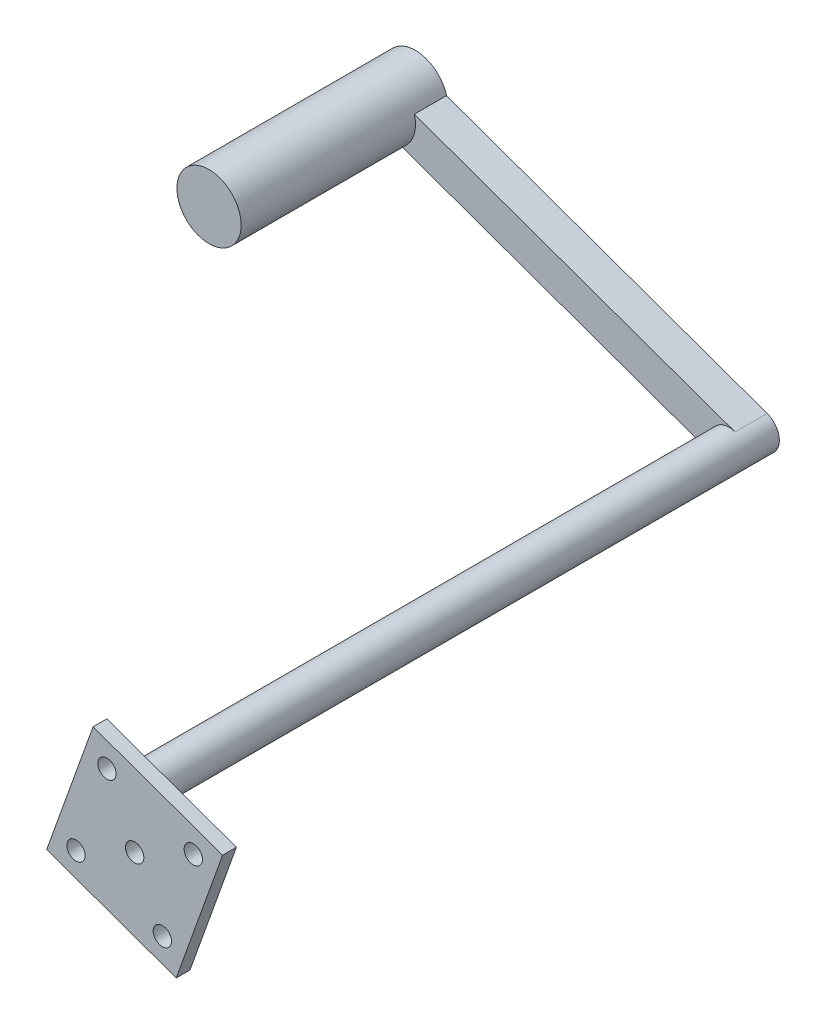
ISO-10303-21;
HEADER;
FILE_DESCRIPTION(('STEP AP214'),'2;1');
FILE_NAME('part.step','',(''),(''),'','','');
FILE_SCHEMA(('AUTOMOTIVE_DESIGN { 1 0 10303 214 1 1 1 1 }'));
ENDSEC;
DATA;
#1=APPLICATION_CONTEXT('core data for automotive mechanical design processes');
#2=APPLICATION_PROTOCOL_DEFINITION('international standard','automotive_design',2000,#1);
#3=PRODUCT_CONTEXT('',#1,'mechanical');
#4=PRODUCT('Part','Part','',(#3));
#5=PRODUCT_RELATED_PRODUCT_CATEGORY('part','',(#4));
#6=PRODUCT_DEFINITION_FORMATION('','',#4);
#7=PRODUCT_DEFINITION_CONTEXT('part definition',#1,'design');
#8=PRODUCT_DEFINITION('design','',#6,#7);
#9=PRODUCT_DEFINITION_SHAPE('','',#8);
#10=(LENGTH_UNIT() NAMED_UNIT(*) SI_UNIT(.MILLI.,.METRE.));
#11=(NAMED_UNIT(*) PLANE_ANGLE_UNIT() SI_UNIT($,.RADIAN.));
#12=(NAMED_UNIT(*) SI_UNIT($,.STERADIAN.) SOLID_ANGLE_UNIT());
#13=UNCERTAINTY_MEASURE_WITH_UNIT(LENGTH_MEASURE(1.E-05),#10,'distance_accuracy_value','');
#14=(GEOMETRIC_REPRESENTATION_CONTEXT(3) GLOBAL_UNCERTAINTY_ASSIGNED_CONTEXT((#13)) GLOBAL_UNIT_ASSIGNED_CONTEXT((#10,
#11,#12)) REPRESENTATION_CONTEXT('',''));
#15=CARTESIAN_POINT('',(0.,0.,0.));
#16=DIRECTION('',(0.,0.,1.));
#17=DIRECTION('',(1.,0.,0.));
#18=AXIS2_PLACEMENT_3D('',#15,#16,#17);
#19=CARTESIAN_POINT('',(-86.6066497970745,-63.7835303855215,45.));
#20=DIRECTION('',(0.,0.,-1.));
#21=DIRECTION('',(-1.,0.,0.));
#22=AXIS2_PLACEMENT_3D('',#19,#20,#21);
#23=CYLINDRICAL_SURFACE('',#22,7.);
#24=CARTESIAN_POINT('',(-86.6066497970745,-63.7835303855215,0.));
#25=DIRECTION('',(0.,0.,1.));
#26=DIRECTION('',(1.,0.,0.));
#27=AXIS2_PLACEMENT_3D('',#24,#25,#26);
#28=CIRCLE('',#27,7.);
#29=CARTESIAN_POINT('',(-79.8496648741146,-61.9551007995401,0.));
#30=VERTEX_POINT('',#29);
#31=CARTESIAN_POINT('',(-82.5475279582593,-69.4864708461657,0.));
#32=VERTEX_POINT('',#31);
#33=EDGE_CURVE('E161',#30,#32,#28,.T.);
#34=ORIENTED_EDGE('',*,*,#33,.T.);
#35=DIRECTION('',(0.,0.,-1.));
#36=VECTOR('',#35,1.);
#37=CARTESIAN_POINT('',(-82.5475279582593,-69.4864708461657,45.));
#38=LINE('',#37,#36);
#39=CARTESIAN_POINT('',(-82.5475279582593,-69.4864708461657,7.));
#40=VERTEX_POINT('',#39);
#41=EDGE_CURVE('E55',#32,#40,#38,.F.);
#42=ORIENTED_EDGE('',*,*,#41,.T.);
#43=CARTESIAN_POINT('',(-86.6066497970745,-63.7835303855215,7.));
#44=DIRECTION('',(0.,0.,-1.));
#45=DIRECTION('',(-1.,0.,0.));
#46=AXIS2_PLACEMENT_3D('',#43,#44,#45);
#47=CIRCLE('',#46,7.);
#48=CARTESIAN_POINT('',(-79.8496648741146,-61.9551007995401,7.));
#49=VERTEX_POINT('',#48);
#50=EDGE_CURVE('E11',#49,#40,#47,.T.);
#51=ORIENTED_EDGE('',*,*,#50,.F.);
#52=DIRECTION('',(0.,0.,-1.));
#53=VECTOR('',#52,1.);
#54=CARTESIAN_POINT('',(-79.8496648741146,-61.9551007995401,45.));
#55=LINE('',#54,#53);
#56=EDGE_CURVE('E156',#49,#30,#55,.T.);
#57=ORIENTED_EDGE('',*,*,#56,.T.);
#58=EDGE_LOOP('',(#34,#42,#51,#57));
#59=FACE_BOUND('',#58,.T.);
#60=CARTESIAN_POINT('',(-86.6066497970745,-63.7835303855215,45.));
#61=DIRECTION('',(0.,0.,1.));
#62=DIRECTION('',(1.,0.,0.));
#63=AXIS2_PLACEMENT_3D('',#60,#61,#62);
#64=CIRCLE('',#63,7.);
#65=CARTESIAN_POINT('',(-79.6066497970745,-63.7835303855215,45.));
#66=VERTEX_POINT('',#65);
#67=EDGE_CURVE('E48',#66,#66,#64,.T.);
#68=ORIENTED_EDGE('',*,*,#67,.F.);
#69=EDGE_LOOP('',(#68));
#70=FACE_BOUND('',#69,.T.);
#71=ADVANCED_FACE('F41',(#59,#70),#23,.T.);
#72=CARTESIAN_POINT('',(-86.6066497970745,-63.7835303855215,45.));
#73=DIRECTION('',(0.,0.,1.));
#74=DIRECTION('',(1.,0.,0.));
#75=AXIS2_PLACEMENT_3D('',#72,#73,#74);
#76=PLANE('',#75);
#77=ORIENTED_EDGE('',*,*,#67,.T.);
#78=EDGE_LOOP('',(#77));
#79=FACE_BOUND('',#78,.T.);
#80=ADVANCED_FACE('F191',(#79),#76,.T.);
#81=CARTESIAN_POINT('',(-86.6066497970745,-63.7835303855215,0.));
#82=DIRECTION('',(0.,0.,1.));
#83=DIRECTION('',(1.,0.,0.));
#84=AXIS2_PLACEMENT_3D('',#81,#82,#83);
#85=PLANE('',#84);
#86=ORIENTED_EDGE('',*,*,#33,.F.);
#87=DIRECTION('',(0.941421255828203,-0.337232885518078,0.));
#88=VECTOR('',#87,1.);
#89=CARTESIAN_POINT('',(-85.2577182550022,-60.0178453622087,0.));
#90=LINE('',#89,#88);
#91=CARTESIAN_POINT('',(-9.94401778874597,-86.9964762036549,0.));
#92=VERTEX_POINT('',#91);
#93=EDGE_CURVE('E138',#30,#92,#90,.T.);
#94=ORIENTED_EDGE('',*,*,#93,.T.);
#95=CARTESIAN_POINT('',(-11.2929493308183,-90.7621612269677,0.));
#96=DIRECTION('',(0.,0.,-1.));
#97=DIRECTION('',(-1.,0.,0.));
#98=AXIS2_PLACEMENT_3D('',#95,#96,#97);
#99=CIRCLE('',#98,4.00000000000002);
#100=CARTESIAN_POINT('',(-12.6418808728906,-94.5278462502806,0.));
#101=VERTEX_POINT('',#100);
#102=EDGE_CURVE('E149',#92,#101,#99,.T.);
#103=ORIENTED_EDGE('',*,*,#102,.T.);
#104=DIRECTION('',(-0.941421255828203,0.337232885518078,0.));
#105=VECTOR('',#104,1.);
#106=CARTESIAN_POINT('',(-87.9555813391469,-67.5492154088343,0.));
#107=LINE('',#106,#105);
#108=EDGE_CURVE('E144',#101,#32,#107,.T.);
#109=ORIENTED_EDGE('',*,*,#108,.T.);
#110=EDGE_LOOP('',(#86,#94,#103,#109));
#111=FACE_BOUND('',#110,.T.);
#112=ADVANCED_FACE('F170',(#111),#85,.F.);
#113=CARTESIAN_POINT('',(-87.9555813391469,-67.5492154088343,7.));
#114=DIRECTION('',(-0.337232885518078,-0.941421255828203,0.));
#115=DIRECTION('',(0.941421255828203,-0.337232885518078,0.));
#116=AXIS2_PLACEMENT_3D('',#113,#114,#115);
#117=PLANE('',#116);
#118=ORIENTED_EDGE('',*,*,#41,.F.);
#119=ORIENTED_EDGE('',*,*,#108,.F.);
#120=DIRECTION('',(0.,0.,-1.));
#121=VECTOR('',#120,1.);
#122=CARTESIAN_POINT('',(-12.6418808728906,-94.5278462502806,7.));
#123=LINE('',#122,#121);
#124=CARTESIAN_POINT('',(-12.6418808728906,-94.5278462502806,7.));
#125=VERTEX_POINT('',#124);
#126=EDGE_CURVE('E154',#125,#101,#123,.T.);
#127=ORIENTED_EDGE('',*,*,#126,.F.);
#128=DIRECTION('',(-0.941421255828203,0.337232885518078,0.));
#129=VECTOR('',#128,1.);
#130=CARTESIAN_POINT('',(-87.9555813391469,-67.5492154088343,7.));
#131=LINE('',#130,#129);
#132=EDGE_CURVE('E143',#125,#40,#131,.T.);
#133=ORIENTED_EDGE('',*,*,#132,.T.);
#134=EDGE_LOOP('',(#118,#119,#127,#133));
#135=FACE_BOUND('',#134,.T.);
#136=ADVANCED_FACE('F168',(#135),#117,.T.);
#137=CARTESIAN_POINT('',(-85.2577182550022,-60.0178453622087,7.));
#138=DIRECTION('',(0.337232885518078,0.941421255828203,0.));
#139=DIRECTION('',(-0.941421255828203,0.337232885518078,0.));
#140=AXIS2_PLACEMENT_3D('',#137,#138,#139);
#141=PLANE('',#140);
#142=ORIENTED_EDGE('',*,*,#56,.F.);
#143=DIRECTION('',(0.941421255828203,-0.337232885518078,0.));
#144=VECTOR('',#143,1.);
#145=CARTESIAN_POINT('',(-85.2577182550022,-60.0178453622087,7.));
#146=LINE('',#145,#144);
#147=CARTESIAN_POINT('',(-9.94401778874597,-86.9964762036549,7.));
#148=VERTEX_POINT('',#147);
#149=EDGE_CURVE('E140',#49,#148,#146,.T.);
#150=ORIENTED_EDGE('',*,*,#149,.T.);
#151=DIRECTION('',(0.,0.,-1.));
#152=VECTOR('',#151,1.);
#153=CARTESIAN_POINT('',(-9.94401778874597,-86.9964762036549,7.));
#154=LINE('',#153,#152);
#155=EDGE_CURVE('E147',#148,#92,#154,.T.);
#156=ORIENTED_EDGE('',*,*,#155,.T.);
#157=ORIENTED_EDGE('',*,*,#93,.F.);
#158=EDGE_LOOP('',(#142,#150,#156,#157));
#159=FACE_BOUND('',#158,.T.);
#160=ADVANCED_FACE('F180',(#159),#141,.T.);
#161=CARTESIAN_POINT('',(-11.2929493308183,-90.7621612269677,7.));
#162=DIRECTION('',(0.,0.,-1.));
#163=DIRECTION('',(-1.,0.,0.));
#164=AXIS2_PLACEMENT_3D('',#161,#162,#163);
#165=CYLINDRICAL_SURFACE('',#164,4.00000000000002);
#166=ORIENTED_EDGE('',*,*,#102,.F.);
#167=ORIENTED_EDGE('',*,*,#155,.F.);
#168=CARTESIAN_POINT('',(-11.2929493308183,-90.7621612269677,7.));
#169=DIRECTION('',(0.,0.,1.));
#170=DIRECTION('',(1.,0.,0.));
#171=AXIS2_PLACEMENT_3D('',#168,#169,#170);
#172=CIRCLE('',#171,4.00000000000002);
#173=EDGE_CURVE('E128',#148,#125,#172,.T.);
#174=ORIENTED_EDGE('',*,*,#173,.T.);
#175=ORIENTED_EDGE('',*,*,#126,.T.);
#176=EDGE_LOOP('',(#166,#167,#174,#175));
#177=FACE_BOUND('',#176,.T.);
#178=CARTESIAN_POINT('',(-11.2929493308183,-90.7621612269677,142.));
#179=DIRECTION('',(0.,0.,1.));
#180=DIRECTION('',(1.,0.,0.));
#181=AXIS2_PLACEMENT_3D('',#178,#179,#180);
#182=CIRCLE('',#181,4.00000000000002);
#183=CARTESIAN_POINT('',(-7.29294933081827,-90.7621612269677,142.));
#184=VERTEX_POINT('',#183);
#185=EDGE_CURVE('E131',#184,#184,#182,.T.);
#186=ORIENTED_EDGE('',*,*,#185,.F.);
#187=EDGE_LOOP('',(#186));
#188=FACE_BOUND('',#187,.T.);
#189=ADVANCED_FACE('F174',(#177,#188),#165,.T.);
#190=CARTESIAN_POINT('',(-86.6066497970745,-63.7835303855215,7.));
#191=DIRECTION('',(0.,0.,-1.));
#192=DIRECTION('',(-1.,0.,0.));
#193=AXIS2_PLACEMENT_3D('',#190,#191,#192);
#194=PLANE('',#193);
#195=ORIENTED_EDGE('',*,*,#173,.F.);
#196=ORIENTED_EDGE('',*,*,#149,.F.);
#197=ORIENTED_EDGE('',*,*,#50,.T.);
#198=ORIENTED_EDGE('',*,*,#132,.F.);
#199=EDGE_LOOP('',(#195,#196,#197,#198));
#200=FACE_BOUND('',#199,.T.);
#201=ADVANCED_FACE('F178',(#200),#194,.F.);
#202=CARTESIAN_POINT('',(0.,0.,145.));
#203=DIRECTION('',(0.,0.,-1.));
#204=DIRECTION('',(-1.,0.,0.));
#205=AXIS2_PLACEMENT_3D('',#202,#203,#204);
#206=PLANE('',#205);
#207=DIRECTION('',(-0.337232885518078,-0.941421255828203,0.));
#208=VECTOR('',#207,1.);
#209=CARTESIAN_POINT('',(-21.9999701485587,-102.860082751282,145.));
#210=LINE('',#209,#208);
#211=CARTESIAN_POINT('',(-11.8829835830164,-74.6174450764363,145.));
#212=VERTEX_POINT('',#211);
#213=CARTESIAN_POINT('',(-21.9999701485587,-102.860082751282,145.));
#214=VERTEX_POINT('',#213);
#215=EDGE_CURVE('E113',#212,#214,#210,.T.);
#216=ORIENTED_EDGE('',*,*,#215,.T.);
#217=DIRECTION('',(0.941421255828203,-0.337232885518078,0.));
#218=VECTOR('',#217,1.);
#219=CARTESIAN_POINT('',(6.2426675262874,-112.977069316825,145.));
#220=LINE('',#219,#218);
#221=CARTESIAN_POINT('',(6.2426675262874,-112.977069316825,145.));
#222=VERTEX_POINT('',#221);
#223=EDGE_CURVE('E102',#214,#222,#220,.T.);
#224=ORIENTED_EDGE('',*,*,#223,.T.);
#225=DIRECTION('',(0.337232885518078,0.941421255828203,0.));
#226=VECTOR('',#225,1.);
#227=CARTESIAN_POINT('',(16.3596540918297,-84.7344316419786,145.));
#228=LINE('',#227,#226);
#229=CARTESIAN_POINT('',(16.3596540918297,-84.7344316419786,145.));
#230=VERTEX_POINT('',#229);
#231=EDGE_CURVE('E112',#222,#230,#228,.T.);
#232=ORIENTED_EDGE('',*,*,#231,.T.);
#233=DIRECTION('',(-0.941421255828203,0.337232885518078,0.));
#234=VECTOR('',#233,1.);
#235=CARTESIAN_POINT('',(-11.8829835830164,-74.6174450764363,145.));
#236=LINE('',#235,#234);
#237=EDGE_CURVE('E119',#230,#212,#236,.T.);
#238=ORIENTED_EDGE('',*,*,#237,.T.);
#239=EDGE_LOOP('',(#216,#224,#232,#238));
#240=FACE_BOUND('',#239,.T.);
#241=CARTESIAN_POINT('',(-8.86204173146574,-81.0107157831677,145.));
#242=DIRECTION('',(0.,0.,1.));
#243=DIRECTION('',(1.,0.,0.));
#244=AXIS2_PLACEMENT_3D('',#241,#242,#243);
#245=CIRCLE('',#244,2.);
#246=CARTESIAN_POINT('',(-6.86204173146574,-81.0107157831677,145.));
#247=VERTEX_POINT('',#246);
#248=EDGE_CURVE('E367',#247,#247,#245,.T.);
#249=ORIENTED_EDGE('',*,*,#248,.F.);
#250=EDGE_LOOP('',(#249));
#251=FACE_BOUND('',#250,.T.);
#252=CARTESIAN_POINT('',(9.96638338509832,-87.7553734935292,145.));
#253=DIRECTION('',(0.,0.,1.));
#254=DIRECTION('',(1.,0.,0.));
#255=AXIS2_PLACEMENT_3D('',#252,#253,#254);
#256=CIRCLE('',#255,2.);
#257=CARTESIAN_POINT('',(11.9663833850983,-87.7553734935292,145.));
#258=VERTEX_POINT('',#257);
#259=EDGE_CURVE('E361',#258,#258,#256,.T.);
#260=ORIENTED_EDGE('',*,*,#259,.F.);
#261=EDGE_LOOP('',(#260));
#262=FACE_BOUND('',#261,.T.);
#263=CARTESIAN_POINT('',(-15.6066994418273,-99.8391408997317,145.));
#264=DIRECTION('',(0.,0.,1.));
#265=DIRECTION('',(1.,0.,0.));
#266=AXIS2_PLACEMENT_3D('',#263,#264,#265);
#267=CIRCLE('',#266,2.);
#268=CARTESIAN_POINT('',(-13.6066994418273,-99.8391408997317,145.));
#269=VERTEX_POINT('',#268);
#270=EDGE_CURVE('E355',#269,#269,#267,.T.);
#271=ORIENTED_EDGE('',*,*,#270,.F.);
#272=EDGE_LOOP('',(#271));
#273=FACE_BOUND('',#272,.T.);
#274=CARTESIAN_POINT('',(3.22172567473678,-106.583798610093,145.));
#275=DIRECTION('',(0.,0.,1.));
#276=DIRECTION('',(1.,0.,0.));
#277=AXIS2_PLACEMENT_3D('',#274,#275,#276);
#278=CIRCLE('',#277,2.);
#279=CARTESIAN_POINT('',(5.22172567473677,-106.583798610093,145.));
#280=VERTEX_POINT('',#279);
#281=EDGE_CURVE('E349',#280,#280,#278,.T.);
#282=ORIENTED_EDGE('',*,*,#281,.F.);
#283=EDGE_LOOP('',(#282));
#284=FACE_BOUND('',#283,.T.);
#285=CARTESIAN_POINT('',(-2.82015802836448,-93.7972571966305,145.));
#286=DIRECTION('',(0.,0.,1.));
#287=DIRECTION('',(1.,0.,0.));
#288=AXIS2_PLACEMENT_3D('',#285,#286,#287);
#289=CIRCLE('',#288,2.);
#290=CARTESIAN_POINT('',(-0.820158028364483,-93.7972571966305,145.));
#291=VERTEX_POINT('',#290);
#292=EDGE_CURVE('E340',#291,#291,#289,.T.);
#293=ORIENTED_EDGE('',*,*,#292,.F.);
#294=EDGE_LOOP('',(#293));
#295=FACE_BOUND('',#294,.T.);
#296=ADVANCED_FACE('F116',(#240,#251,#262,#273,#284,#295),#206,.F.);
#297=CARTESIAN_POINT('',(0.,0.,142.));
#298=DIRECTION('',(0.,0.,-1.));
#299=DIRECTION('',(-1.,0.,0.));
#300=AXIS2_PLACEMENT_3D('',#297,#298,#299);
#301=PLANE('',#300);
#302=ORIENTED_EDGE('',*,*,#185,.T.);
#303=EDGE_LOOP('',(#302));
#304=FACE_BOUND('',#303,.T.);
#305=CARTESIAN_POINT('',(3.22172567473678,-106.583798610093,142.));
#306=DIRECTION('',(0.,0.,1.));
#307=DIRECTION('',(1.,0.,0.));
#308=AXIS2_PLACEMENT_3D('',#305,#306,#307);
#309=CIRCLE('',#308,2.);
#310=CARTESIAN_POINT('',(5.22172567473677,-106.583798610093,142.));
#311=VERTEX_POINT('',#310);
#312=EDGE_CURVE('E346',#311,#311,#309,.T.);
#313=ORIENTED_EDGE('',*,*,#312,.T.);
#314=EDGE_LOOP('',(#313));
#315=FACE_BOUND('',#314,.T.);
#316=CARTESIAN_POINT('',(9.96638338509832,-87.7553734935292,142.));
#317=DIRECTION('',(0.,0.,1.));
#318=DIRECTION('',(1.,0.,0.));
#319=AXIS2_PLACEMENT_3D('',#316,#317,#318);
#320=CIRCLE('',#319,2.);
#321=CARTESIAN_POINT('',(11.9663833850983,-87.7553734935292,142.));
#322=VERTEX_POINT('',#321);
#323=EDGE_CURVE('E358',#322,#322,#320,.T.);
#324=ORIENTED_EDGE('',*,*,#323,.T.);
#325=EDGE_LOOP('',(#324));
#326=FACE_BOUND('',#325,.T.);
#327=DIRECTION('',(-0.337232885518078,-0.941421255828203,0.));
#328=VECTOR('',#327,1.);
#329=CARTESIAN_POINT('',(-21.9999701485587,-102.860082751282,142.));
#330=LINE('',#329,#328);
#331=CARTESIAN_POINT('',(-11.8829835830164,-74.6174450764363,142.));
#332=VERTEX_POINT('',#331);
#333=CARTESIAN_POINT('',(-21.9999701485587,-102.860082751282,142.));
#334=VERTEX_POINT('',#333);
#335=EDGE_CURVE('E127',#332,#334,#330,.T.);
#336=ORIENTED_EDGE('',*,*,#335,.F.);
#337=DIRECTION('',(-0.941421255828203,0.337232885518078,0.));
#338=VECTOR('',#337,1.);
#339=CARTESIAN_POINT('',(-11.8829835830164,-74.6174450764363,142.));
#340=LINE('',#339,#338);
#341=CARTESIAN_POINT('',(16.3596540918297,-84.7344316419786,142.));
#342=VERTEX_POINT('',#341);
#343=EDGE_CURVE('E123',#342,#332,#340,.T.);
#344=ORIENTED_EDGE('',*,*,#343,.F.);
#345=DIRECTION('',(0.337232885518078,0.941421255828203,0.));
#346=VECTOR('',#345,1.);
#347=CARTESIAN_POINT('',(16.3596540918297,-84.7344316419786,142.));
#348=LINE('',#347,#346);
#349=CARTESIAN_POINT('',(6.2426675262874,-112.977069316825,142.));
#350=VERTEX_POINT('',#349);
#351=EDGE_CURVE('E378',#350,#342,#348,.T.);
#352=ORIENTED_EDGE('',*,*,#351,.F.);
#353=DIRECTION('',(0.941421255828203,-0.337232885518078,0.));
#354=VECTOR('',#353,1.);
#355=CARTESIAN_POINT('',(6.2426675262874,-112.977069316825,142.));
#356=LINE('',#355,#354);
#357=EDGE_CURVE('E376',#334,#350,#356,.T.);
#358=ORIENTED_EDGE('',*,*,#357,.F.);
#359=EDGE_LOOP('',(#336,#344,#352,#358));
#360=FACE_BOUND('',#359,.T.);
#361=CARTESIAN_POINT('',(-8.86204173146574,-81.0107157831677,142.));
#362=DIRECTION('',(0.,0.,1.));
#363=DIRECTION('',(1.,0.,0.));
#364=AXIS2_PLACEMENT_3D('',#361,#362,#363);
#365=CIRCLE('',#364,2.);
#366=CARTESIAN_POINT('',(-6.86204173146574,-81.0107157831677,142.));
#367=VERTEX_POINT('',#366);
#368=EDGE_CURVE('E364',#367,#367,#365,.T.);
#369=ORIENTED_EDGE('',*,*,#368,.T.);
#370=EDGE_LOOP('',(#369));
#371=FACE_BOUND('',#370,.T.);
#372=CARTESIAN_POINT('',(-15.6066994418273,-99.8391408997317,142.));
#373=DIRECTION('',(0.,0.,1.));
#374=DIRECTION('',(1.,0.,0.));
#375=AXIS2_PLACEMENT_3D('',#372,#373,#374);
#376=CIRCLE('',#375,2.);
#377=CARTESIAN_POINT('',(-13.6066994418273,-99.8391408997317,142.));
#378=VERTEX_POINT('',#377);
#379=EDGE_CURVE('E352',#378,#378,#376,.T.);
#380=ORIENTED_EDGE('',*,*,#379,.T.);
#381=EDGE_LOOP('',(#380));
#382=FACE_BOUND('',#381,.T.);
#383=CARTESIAN_POINT('',(-2.82015802836448,-93.7972571966305,142.));
#384=DIRECTION('',(0.,0.,1.));
#385=DIRECTION('',(1.,0.,0.));
#386=AXIS2_PLACEMENT_3D('',#383,#384,#385);
#387=CIRCLE('',#386,2.);
#388=CARTESIAN_POINT('',(-0.820158028364483,-93.7972571966305,142.));
#389=VERTEX_POINT('',#388);
#390=EDGE_CURVE('E343',#389,#389,#387,.T.);
#391=ORIENTED_EDGE('',*,*,#390,.T.);
#392=EDGE_LOOP('',(#391));
#393=FACE_BOUND('',#392,.T.);
#394=ADVANCED_FACE('F238',(#304,#315,#326,#360,#371,#382,#393),#301,.T.);
#395=CARTESIAN_POINT('',(-21.9999701485587,-102.860082751282,145.));
#396=DIRECTION('',(0.941421255828203,-0.337232885518078,0.));
#397=DIRECTION('',(0.337232885518078,0.941421255828203,0.));
#398=AXIS2_PLACEMENT_3D('',#395,#396,#397);
#399=PLANE('',#398);
#400=ORIENTED_EDGE('',*,*,#335,.T.);
#401=DIRECTION('',(0.,0.,-1.));
#402=VECTOR('',#401,1.);
#403=CARTESIAN_POINT('',(-21.9999701485587,-102.860082751282,145.));
#404=LINE('',#403,#402);
#405=EDGE_CURVE('E106',#214,#334,#404,.T.);
#406=ORIENTED_EDGE('',*,*,#405,.F.);
#407=ORIENTED_EDGE('',*,*,#215,.F.);
#408=DIRECTION('',(0.,0.,-1.));
#409=VECTOR('',#408,1.);
#410=CARTESIAN_POINT('',(-11.8829835830164,-74.6174450764363,145.));
#411=LINE('',#410,#409);
#412=EDGE_CURVE('E374',#212,#332,#411,.T.);
#413=ORIENTED_EDGE('',*,*,#412,.T.);
#414=EDGE_LOOP('',(#400,#406,#407,#413));
#415=FACE_BOUND('',#414,.T.);
#416=ADVANCED_FACE('F125',(#415),#399,.F.);
#417=CARTESIAN_POINT('',(6.2426675262874,-112.977069316825,145.));
#418=DIRECTION('',(0.337232885518078,0.941421255828203,0.));
#419=DIRECTION('',(-0.941421255828203,0.337232885518078,0.));
#420=AXIS2_PLACEMENT_3D('',#417,#418,#419);
#421=PLANE('',#420);
#422=ORIENTED_EDGE('',*,*,#357,.T.);
#423=DIRECTION('',(0.,0.,-1.));
#424=VECTOR('',#423,1.);
#425=CARTESIAN_POINT('',(6.2426675262874,-112.977069316825,145.));
#426=LINE('',#425,#424);
#427=EDGE_CURVE('E109',#222,#350,#426,.T.);
#428=ORIENTED_EDGE('',*,*,#427,.F.);
#429=ORIENTED_EDGE('',*,*,#223,.F.);
#430=ORIENTED_EDGE('',*,*,#405,.T.);
#431=EDGE_LOOP('',(#422,#428,#429,#430));
#432=FACE_BOUND('',#431,.T.);
#433=ADVANCED_FACE('F104',(#432),#421,.F.);
#434=CARTESIAN_POINT('',(16.3596540918297,-84.7344316419786,145.));
#435=DIRECTION('',(-0.941421255828203,0.337232885518078,0.));
#436=DIRECTION('',(-0.337232885518078,-0.941421255828203,0.));
#437=AXIS2_PLACEMENT_3D('',#434,#435,#436);
#438=PLANE('',#437);
#439=ORIENTED_EDGE('',*,*,#351,.T.);
#440=DIRECTION('',(0.,0.,-1.));
#441=VECTOR('',#440,1.);
#442=CARTESIAN_POINT('',(16.3596540918297,-84.7344316419786,145.));
#443=LINE('',#442,#441);
#444=EDGE_CURVE('E133',#230,#342,#443,.T.);
#445=ORIENTED_EDGE('',*,*,#444,.F.);
#446=ORIENTED_EDGE('',*,*,#231,.F.);
#447=ORIENTED_EDGE('',*,*,#427,.T.);
#448=EDGE_LOOP('',(#439,#445,#446,#447));
#449=FACE_BOUND('',#448,.T.);
#450=ADVANCED_FACE('F260',(#449),#438,.F.);
#451=CARTESIAN_POINT('',(-11.8829835830164,-74.6174450764363,145.));
#452=DIRECTION('',(-0.337232885518078,-0.941421255828203,0.));
#453=DIRECTION('',(0.941421255828203,-0.337232885518078,0.));
#454=AXIS2_PLACEMENT_3D('',#451,#452,#453);
#455=PLANE('',#454);
#456=ORIENTED_EDGE('',*,*,#343,.T.);
#457=ORIENTED_EDGE('',*,*,#412,.F.);
#458=ORIENTED_EDGE('',*,*,#237,.F.);
#459=ORIENTED_EDGE('',*,*,#444,.T.);
#460=EDGE_LOOP('',(#456,#457,#458,#459));
#461=FACE_BOUND('',#460,.T.);
#462=ADVANCED_FACE('F268',(#461),#455,.F.);
#463=CARTESIAN_POINT('',(-8.86204173146574,-81.0107157831677,145.));
#464=DIRECTION('',(0.,0.,-1.));
#465=DIRECTION('',(-1.,0.,0.));
#466=AXIS2_PLACEMENT_3D('',#463,#464,#465);
#467=CYLINDRICAL_SURFACE('',#466,2.);
#468=ORIENTED_EDGE('',*,*,#248,.T.);
#469=EDGE_LOOP('',(#468));
#470=FACE_BOUND('',#469,.T.);
#471=ORIENTED_EDGE('',*,*,#368,.F.);
#472=EDGE_LOOP('',(#471));
#473=FACE_BOUND('',#472,.T.);
#474=ADVANCED_FACE('F277',(#470,#473),#467,.F.);
#475=CARTESIAN_POINT('',(9.96638338509832,-87.7553734935292,145.));
#476=DIRECTION('',(0.,0.,-1.));
#477=DIRECTION('',(-1.,0.,0.));
#478=AXIS2_PLACEMENT_3D('',#475,#476,#477);
#479=CYLINDRICAL_SURFACE('',#478,2.);
#480=ORIENTED_EDGE('',*,*,#259,.T.);
#481=EDGE_LOOP('',(#480));
#482=FACE_BOUND('',#481,.T.);
#483=ORIENTED_EDGE('',*,*,#323,.F.);
#484=EDGE_LOOP('',(#483));
#485=FACE_BOUND('',#484,.T.);
#486=ADVANCED_FACE('F286',(#482,#485),#479,.F.);
#487=CARTESIAN_POINT('',(-15.6066994418273,-99.8391408997317,145.));
#488=DIRECTION('',(0.,0.,-1.));
#489=DIRECTION('',(-1.,0.,0.));
#490=AXIS2_PLACEMENT_3D('',#487,#488,#489);
#491=CYLINDRICAL_SURFACE('',#490,2.);
#492=ORIENTED_EDGE('',*,*,#270,.T.);
#493=EDGE_LOOP('',(#492));
#494=FACE_BOUND('',#493,.T.);
#495=ORIENTED_EDGE('',*,*,#379,.F.);
#496=EDGE_LOOP('',(#495));
#497=FACE_BOUND('',#496,.T.);
#498=ADVANCED_FACE('F295',(#494,#497),#491,.F.);
#499=CARTESIAN_POINT('',(3.22172567473678,-106.583798610093,145.));
#500=DIRECTION('',(0.,0.,-1.));
#501=DIRECTION('',(-1.,0.,0.));
#502=AXIS2_PLACEMENT_3D('',#499,#500,#501);
#503=CYLINDRICAL_SURFACE('',#502,2.);
#504=ORIENTED_EDGE('',*,*,#281,.T.);
#505=EDGE_LOOP('',(#504));
#506=FACE_BOUND('',#505,.T.);
#507=ORIENTED_EDGE('',*,*,#312,.F.);
#508=EDGE_LOOP('',(#507));
#509=FACE_BOUND('',#508,.T.);
#510=ADVANCED_FACE('F304',(#506,#509),#503,.F.);
#511=CARTESIAN_POINT('',(-2.82015802836448,-93.7972571966305,145.));
#512=DIRECTION('',(0.,0.,-1.));
#513=DIRECTION('',(-1.,0.,0.));
#514=AXIS2_PLACEMENT_3D('',#511,#512,#513);
#515=CYLINDRICAL_SURFACE('',#514,2.);
#516=ORIENTED_EDGE('',*,*,#292,.T.);
#517=EDGE_LOOP('',(#516));
#518=FACE_BOUND('',#517,.T.);
#519=ORIENTED_EDGE('',*,*,#390,.F.);
#520=EDGE_LOOP('',(#519));
#521=FACE_BOUND('',#520,.T.);
#522=ADVANCED_FACE('F313',(#518,#521),#515,.F.);
#523=CLOSED_SHELL('',(#71,#80,#112,#136,#160,#189,#201,#296,#394,#416,#433,#450,#462,#474,#486,
#498,#510,#522));
#524=MANIFOLD_SOLID_BREP('B2',#523);
#525=ADVANCED_BREP_SHAPE_REPRESENTATION('',(#18,#524),#14);
#526=SHAPE_DEFINITION_REPRESENTATION(#9,#525);
ENDSEC;
END-ISO-10303-21;
